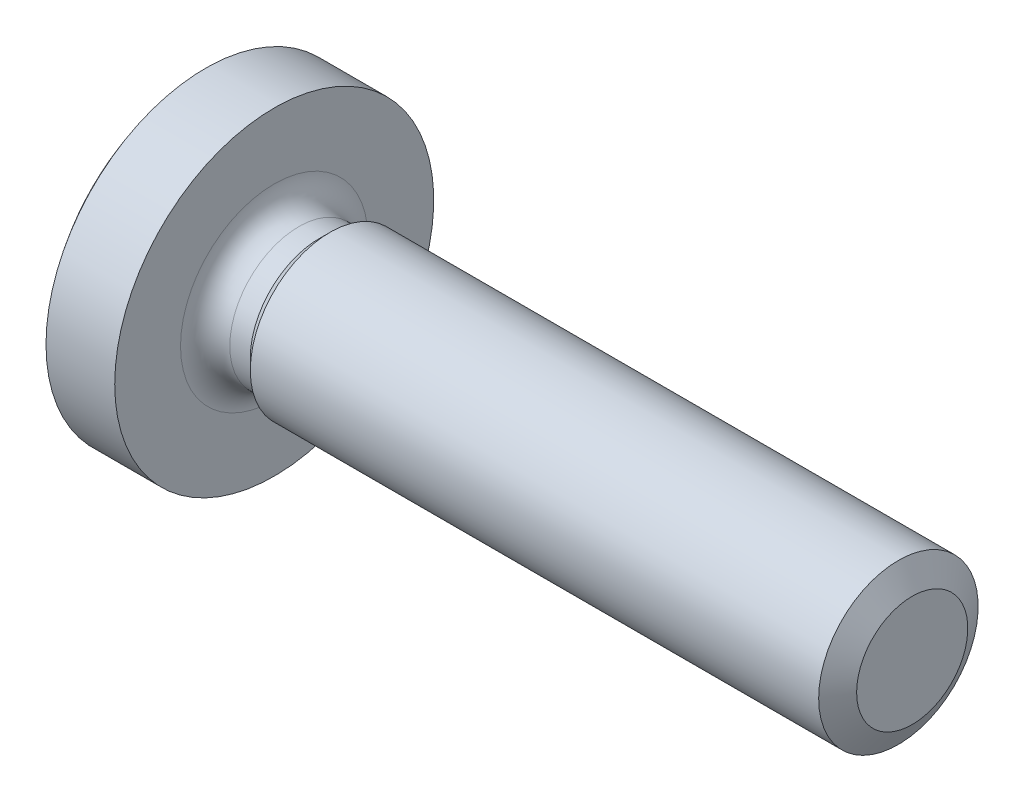
ISO-10303-21;
HEADER;
FILE_DESCRIPTION(('STEP AP214'),'2;1');
FILE_NAME('part.step','',(''),(''),'','','');
FILE_SCHEMA(('AUTOMOTIVE_DESIGN { 1 0 10303 214 1 1 1 1 }'));
ENDSEC;
DATA;
#1=APPLICATION_CONTEXT('core data for automotive mechanical design processes');
#2=APPLICATION_PROTOCOL_DEFINITION('international standard','automotive_design',2000,#1);
#3=PRODUCT_CONTEXT('',#1,'mechanical');
#4=PRODUCT('Part','Part','',(#3));
#5=PRODUCT_RELATED_PRODUCT_CATEGORY('part','',(#4));
#6=PRODUCT_DEFINITION_FORMATION('','',#4);
#7=PRODUCT_DEFINITION_CONTEXT('part definition',#1,'design');
#8=PRODUCT_DEFINITION('design','',#6,#7);
#9=PRODUCT_DEFINITION_SHAPE('','',#8);
#10=(LENGTH_UNIT() NAMED_UNIT(*) SI_UNIT(.MILLI.,.METRE.));
#11=(NAMED_UNIT(*) PLANE_ANGLE_UNIT() SI_UNIT($,.RADIAN.));
#12=(NAMED_UNIT(*) SI_UNIT($,.STERADIAN.) SOLID_ANGLE_UNIT());
#13=UNCERTAINTY_MEASURE_WITH_UNIT(LENGTH_MEASURE(1.E-05),#10,'distance_accuracy_value','');
#14=(GEOMETRIC_REPRESENTATION_CONTEXT(3) GLOBAL_UNCERTAINTY_ASSIGNED_CONTEXT((#13)) GLOBAL_UNIT_ASSIGNED_CONTEXT((#10,
#11,#12)) REPRESENTATION_CONTEXT('',''));
#15=CARTESIAN_POINT('',(0.,0.,0.));
#16=DIRECTION('',(0.,0.,1.));
#17=DIRECTION('',(1.,0.,0.));
#18=AXIS2_PLACEMENT_3D('',#15,#16,#17);
#19=CARTESIAN_POINT('',(2.4,0.,0.));
#20=DIRECTION('',(0.144306893071729,0.,-0.989532981063282));
#21=DIRECTION('',(-0.989532981063282,0.,-0.144306893071729));
#22=AXIS2_PLACEMENT_3D('',#19,#20,#21);
#23=PLANE('',#22);
#24=DIRECTION('',(-0.732931208059297,-0.671853607387689,-0.106885801175314));
#25=VECTOR('',#24,1.);
#26=CARTESIAN_POINT('',(2.4,0.,0.));
#27=LINE('',#26,#25);
#28=CARTESIAN_POINT('',(2.4,0.,0.));
#29=VERTEX_POINT('',#28);
#30=CARTESIAN_POINT('',(0.299339193338267,-1.92560573943992,-0.30634636763817));
#31=VERTEX_POINT('',#30);
#32=EDGE_CURVE('E167',#29,#31,#27,.T.);
#33=ORIENTED_EDGE('',*,*,#32,.F.);
#34=DIRECTION('',(-0.979387903800927,-0.142827402637635,-0.142827402637635));
#35=VECTOR('',#34,1.);
#36=CARTESIAN_POINT('',(2.4,0.,0.));
#37=LINE('',#36,#35);
#38=CARTESIAN_POINT('',(0.0185820115886168,-0.347290123309992,-0.347290123309993));
#39=VERTEX_POINT('',#38);
#40=EDGE_CURVE('E128',#29,#39,#37,.T.);
#41=ORIENTED_EDGE('',*,*,#40,.T.);
#42=CARTESIAN_POINT('',(6.41461963450914,0.,0.585465363365916));
#43=DIRECTION('',(0.144306893071729,0.,-0.989532981063282));
#44=DIRECTION('',(-0.989532981063282,0.,-0.144306893071729));
#45=AXIS2_PLACEMENT_3D('',#42,#43,#44);
#46=CIRCLE('',#45,6.47301633718682);
#47=EDGE_CURVE('E141',#31,#39,#46,.T.);
#48=ORIENTED_EDGE('',*,*,#47,.F.);
#49=EDGE_LOOP('',(#33,#41,#48));
#50=FACE_BOUND('',#49,.T.);
#51=ADVANCED_FACE('F48',(#50),#23,.F.);
#52=CARTESIAN_POINT('',(2.4,0.,0.));
#53=DIRECTION('',(0.144306893071729,0.,0.989532981063282));
#54=DIRECTION('',(0.989532981063282,0.,-0.144306893071729));
#55=AXIS2_PLACEMENT_3D('',#52,#53,#54);
#56=PLANE('',#55);
#57=CARTESIAN_POINT('',(6.41461963450914,0.,-0.585465363365916));
#58=DIRECTION('',(0.144306893071729,0.,0.989532981063282));
#59=DIRECTION('',(0.989532981063282,0.,-0.144306893071729));
#60=AXIS2_PLACEMENT_3D('',#57,#58,#59);
#61=CIRCLE('',#60,6.47301633718682);
#62=CARTESIAN_POINT('',(0.0185820115886177,-0.347290123309995,0.347290123309993));
#63=VERTEX_POINT('',#62);
#64=CARTESIAN_POINT('',(0.299339193338266,-1.92560573943992,0.30634636763817));
#65=VERTEX_POINT('',#64);
#66=EDGE_CURVE('E71',#63,#65,#61,.T.);
#67=ORIENTED_EDGE('',*,*,#66,.F.);
#68=DIRECTION('',(0.979387903800927,0.142827402637636,-0.142827402637635));
#69=VECTOR('',#68,1.);
#70=CARTESIAN_POINT('',(2.4,0.,0.));
#71=LINE('',#70,#69);
#72=EDGE_CURVE('E13',#63,#29,#71,.T.);
#73=ORIENTED_EDGE('',*,*,#72,.T.);
#74=DIRECTION('',(-0.732931208059297,-0.671853607387689,0.106885801175314));
#75=VECTOR('',#74,1.);
#76=CARTESIAN_POINT('',(2.4,0.,0.));
#77=LINE('',#76,#75);
#78=EDGE_CURVE('E168',#29,#65,#77,.T.);
#79=ORIENTED_EDGE('',*,*,#78,.T.);
#80=EDGE_LOOP('',(#67,#73,#79));
#81=FACE_BOUND('',#80,.T.);
#82=ADVANCED_FACE('F183',(#81),#56,.F.);
#83=CARTESIAN_POINT('',(-1.33175770411172,0.,0.));
#84=DIRECTION('',(-1.,0.,0.));
#85=DIRECTION('',(0.,0.,1.));
#86=AXIS2_PLACEMENT_3D('',#83,#84,#85);
#87=CYLINDRICAL_SURFACE('',#86,2.);
#88=CARTESIAN_POINT('',(4.5,0.,0.));
#89=DIRECTION('',(-1.,0.,0.));
#90=DIRECTION('',(0.,0.,1.));
#91=AXIS2_PLACEMENT_3D('',#88,#89,#90);
#92=CIRCLE('',#91,2.);
#93=CARTESIAN_POINT('',(4.5,0.,2.));
#94=VERTEX_POINT('',#93);
#95=EDGE_CURVE('E204',#94,#94,#92,.T.);
#96=ORIENTED_EDGE('',*,*,#95,.F.);
#97=EDGE_LOOP('',(#96));
#98=FACE_BOUND('',#97,.T.);
#99=CARTESIAN_POINT('',(18.753791204021,0.,0.));
#100=DIRECTION('',(-1.,0.,0.));
#101=DIRECTION('',(0.,0.,1.));
#102=AXIS2_PLACEMENT_3D('',#99,#100,#101);
#103=CIRCLE('',#102,2.);
#104=CARTESIAN_POINT('',(18.753791204021,0.,2.));
#105=VERTEX_POINT('',#104);
#106=EDGE_CURVE('E201',#105,#105,#103,.T.);
#107=ORIENTED_EDGE('',*,*,#106,.T.);
#108=EDGE_LOOP('',(#107));
#109=FACE_BOUND('',#108,.T.);
#110=ADVANCED_FACE('F248',(#98,#109),#87,.T.);
#111=CARTESIAN_POINT('',(6.5,0.,0.));
#112=DIRECTION('',(-1.,0.,0.));
#113=DIRECTION('',(0.,1.,0.));
#114=AXIS2_PLACEMENT_3D('',#111,#112,#113);
#115=SPHERICAL_SURFACE('',#114,6.5);
#116=CARTESIAN_POINT('',(4.62792452830189,0.,-2.0422641509434));
#117=DIRECTION('',(0.675724628517346,0.,0.737154140200741));
#118=DIRECTION('',(0.737154140200741,0.,-0.675724628517346));
#119=AXIS2_PLACEMENT_3D('',#116,#117,#118);
#120=CIRCLE('',#119,5.88000770118864);
#121=CARTESIAN_POINT('',(0.299339193338266,0.306346367638162,1.92560573943992));
#122=VERTEX_POINT('',#121);
#123=CARTESIAN_POINT('',(0.299339193338267,-0.306346367638176,1.92560573943992));
#124=VERTEX_POINT('',#123);
#125=EDGE_CURVE('E134',#122,#124,#120,.T.);
#126=ORIENTED_EDGE('',*,*,#125,.T.);
#127=CARTESIAN_POINT('',(6.41461963450914,0.585465363365916,0.));
#128=DIRECTION('',(0.144306893071729,-0.989532981063282,0.));
#129=DIRECTION('',(0.989532981063282,0.144306893071729,0.));
#130=AXIS2_PLACEMENT_3D('',#127,#128,#129);
#131=CIRCLE('',#130,6.47301633718682);
#132=EDGE_CURVE('E150',#124,#63,#131,.T.);
#133=ORIENTED_EDGE('',*,*,#132,.T.);
#134=ORIENTED_EDGE('',*,*,#66,.T.);
#135=CARTESIAN_POINT('',(4.62792452830189,2.0422641509434,0.));
#136=DIRECTION('',(0.675724628517346,-0.737154140200741,0.));
#137=DIRECTION('',(0.737154140200741,0.675724628517346,0.));
#138=AXIS2_PLACEMENT_3D('',#135,#136,#137);
#139=CIRCLE('',#138,5.88000770118864);
#140=EDGE_CURVE('E180',#65,#31,#139,.T.);
#141=ORIENTED_EDGE('',*,*,#140,.T.);
#142=ORIENTED_EDGE('',*,*,#47,.T.);
#143=CARTESIAN_POINT('',(0.299339193338267,-0.306346367638163,-1.92560573943992));
#144=VERTEX_POINT('',#143);
#145=EDGE_CURVE('E130',#39,#144,#131,.T.);
#146=ORIENTED_EDGE('',*,*,#145,.T.);
#147=CARTESIAN_POINT('',(4.62792452830189,0.,2.0422641509434));
#148=DIRECTION('',(0.675724628517346,0.,-0.737154140200741));
#149=DIRECTION('',(-0.737154140200741,0.,-0.675724628517346));
#150=AXIS2_PLACEMENT_3D('',#147,#148,#149);
#151=CIRCLE('',#150,5.88000770118864);
#152=CARTESIAN_POINT('',(0.299339193338266,0.306346367638176,-1.92560573943992));
#153=VERTEX_POINT('',#152);
#154=EDGE_CURVE('E122',#144,#153,#151,.T.);
#155=ORIENTED_EDGE('',*,*,#154,.T.);
#156=CARTESIAN_POINT('',(6.41461963450914,-0.585465363365916,0.));
#157=DIRECTION('',(0.144306893071729,0.989532981063282,0.));
#158=DIRECTION('',(-0.989532981063282,0.144306893071729,0.));
#159=AXIS2_PLACEMENT_3D('',#156,#157,#158);
#160=CIRCLE('',#159,6.47301633718682);
#161=CARTESIAN_POINT('',(0.0185820115886177,0.347290123309994,-0.347290123309993));
#162=VERTEX_POINT('',#161);
#163=EDGE_CURVE('E113',#153,#162,#160,.T.);
#164=ORIENTED_EDGE('',*,*,#163,.T.);
#165=CARTESIAN_POINT('',(0.299339193338267,1.92560573943992,-0.30634636763817));
#166=VERTEX_POINT('',#165);
#167=EDGE_CURVE('E158',#162,#166,#46,.T.);
#168=ORIENTED_EDGE('',*,*,#167,.T.);
#169=CARTESIAN_POINT('',(4.62792452830189,-2.0422641509434,0.));
#170=DIRECTION('',(0.675724628517346,0.737154140200741,0.));
#171=DIRECTION('',(-0.737154140200741,0.675724628517346,0.));
#172=AXIS2_PLACEMENT_3D('',#169,#170,#171);
#173=CIRCLE('',#172,5.88000770118864);
#174=CARTESIAN_POINT('',(0.299339193338266,1.92560573943992,0.306346367638169));
#175=VERTEX_POINT('',#174);
#176=EDGE_CURVE('E171',#166,#175,#173,.T.);
#177=ORIENTED_EDGE('',*,*,#176,.T.);
#178=CARTESIAN_POINT('',(0.0185820115886168,0.347290123309992,0.347290123309993));
#179=VERTEX_POINT('',#178);
#180=EDGE_CURVE('E163',#175,#179,#61,.T.);
#181=ORIENTED_EDGE('',*,*,#180,.T.);
#182=EDGE_CURVE('E63',#179,#122,#160,.T.);
#183=ORIENTED_EDGE('',*,*,#182,.T.);
#184=EDGE_LOOP('',(#126,#133,#134,#141,#142,#146,#155,#164,#168,#177,#181,#183));
#185=FACE_BOUND('',#184,.T.);
#186=CARTESIAN_POINT('',(1.3765246170202,0.,0.));
#187=DIRECTION('',(-1.,0.,0.));
#188=DIRECTION('',(0.,0.,1.));
#189=AXIS2_PLACEMENT_3D('',#186,#187,#188);
#190=CIRCLE('',#189,4.);
#191=CARTESIAN_POINT('',(1.3765246170202,0.,4.));
#192=VERTEX_POINT('',#191);
#193=EDGE_CURVE('E184',#192,#192,#190,.T.);
#194=ORIENTED_EDGE('',*,*,#193,.T.);
#195=EDGE_LOOP('',(#194));
#196=FACE_BOUND('',#195,.T.);
#197=ADVANCED_FACE('F50',(#185,#196),#115,.T.);
#198=CARTESIAN_POINT('',(-1.33175770411172,0.,0.));
#199=DIRECTION('',(-1.,0.,0.));
#200=DIRECTION('',(0.,0.,1.));
#201=AXIS2_PLACEMENT_3D('',#198,#199,#200);
#202=CYLINDRICAL_SURFACE('',#201,4.);
#203=ORIENTED_EDGE('',*,*,#193,.F.);
#204=EDGE_LOOP('',(#203));
#205=FACE_BOUND('',#204,.T.);
#206=CARTESIAN_POINT('',(3.1,0.,0.));
#207=DIRECTION('',(-1.,0.,0.));
#208=DIRECTION('',(0.,0.,1.));
#209=AXIS2_PLACEMENT_3D('',#206,#207,#208);
#210=CIRCLE('',#209,4.);
#211=CARTESIAN_POINT('',(3.1,0.,4.));
#212=VERTEX_POINT('',#211);
#213=EDGE_CURVE('E187',#212,#212,#210,.T.);
#214=ORIENTED_EDGE('',*,*,#213,.T.);
#215=EDGE_LOOP('',(#214));
#216=FACE_BOUND('',#215,.T.);
#217=ADVANCED_FACE('F221',(#205,#216),#202,.T.);
#218=CARTESIAN_POINT('',(3.1,2.35,0.));
#219=DIRECTION('',(-1.,0.,0.));
#220=DIRECTION('',(0.,0.,1.));
#221=AXIS2_PLACEMENT_3D('',#218,#219,#220);
#222=PLANE('',#221);
#223=ORIENTED_EDGE('',*,*,#213,.F.);
#224=EDGE_LOOP('',(#223));
#225=FACE_BOUND('',#224,.T.);
#226=CARTESIAN_POINT('',(3.1,0.,0.));
#227=DIRECTION('',(-1.,0.,0.));
#228=DIRECTION('',(0.,0.,1.));
#229=AXIS2_PLACEMENT_3D('',#226,#227,#228);
#230=CIRCLE('',#229,2.35);
#231=CARTESIAN_POINT('',(3.1,0.,2.35));
#232=VERTEX_POINT('',#231);
#233=EDGE_CURVE('E213',#232,#232,#230,.T.);
#234=ORIENTED_EDGE('',*,*,#233,.T.);
#235=EDGE_LOOP('',(#234));
#236=FACE_BOUND('',#235,.T.);
#237=ADVANCED_FACE('F223',(#225,#236),#222,.F.);
#238=CARTESIAN_POINT('',(3.718,0.,0.));
#239=DIRECTION('',(-1.,0.,0.));
#240=DIRECTION('',(0.,0.,1.));
#241=AXIS2_PLACEMENT_3D('',#238,#239,#240);
#242=TOROIDAL_SURFACE('',#241,2.35,0.618);
#243=ORIENTED_EDGE('',*,*,#233,.F.);
#244=EDGE_LOOP('',(#243));
#245=FACE_BOUND('',#244,.T.);
#246=CARTESIAN_POINT('',(3.718,0.,0.));
#247=DIRECTION('',(-1.,0.,0.));
#248=DIRECTION('',(0.,0.,1.));
#249=AXIS2_PLACEMENT_3D('',#246,#247,#248);
#250=CIRCLE('',#249,1.732);
#251=CARTESIAN_POINT('',(3.718,0.,1.732));
#252=VERTEX_POINT('',#251);
#253=EDGE_CURVE('E210',#252,#252,#250,.T.);
#254=ORIENTED_EDGE('',*,*,#253,.T.);
#255=EDGE_LOOP('',(#254));
#256=FACE_BOUND('',#255,.T.);
#257=ADVANCED_FACE('F226',(#245,#256),#242,.F.);
#258=CARTESIAN_POINT('',(-1.33175770411172,0.,0.));
#259=DIRECTION('',(-1.,0.,0.));
#260=DIRECTION('',(0.,0.,1.));
#261=AXIS2_PLACEMENT_3D('',#258,#259,#260);
#262=CYLINDRICAL_SURFACE('',#261,1.732);
#263=ORIENTED_EDGE('',*,*,#253,.F.);
#264=EDGE_LOOP('',(#263));
#265=FACE_BOUND('',#264,.T.);
#266=CARTESIAN_POINT('',(4.232,0.,0.));
#267=DIRECTION('',(-1.,0.,0.));
#268=DIRECTION('',(0.,0.,1.));
#269=AXIS2_PLACEMENT_3D('',#266,#267,#268);
#270=CIRCLE('',#269,1.732);
#271=CARTESIAN_POINT('',(4.232,0.,1.732));
#272=VERTEX_POINT('',#271);
#273=EDGE_CURVE('E207',#272,#272,#270,.T.);
#274=ORIENTED_EDGE('',*,*,#273,.T.);
#275=EDGE_LOOP('',(#274));
#276=FACE_BOUND('',#275,.T.);
#277=ADVANCED_FACE('F232',(#265,#276),#262,.T.);
#278=CARTESIAN_POINT('',(4.5,0.,0.));
#279=DIRECTION('',(1.,0.,0.));
#280=DIRECTION('',(0.,0.,-1.));
#281=AXIS2_PLACEMENT_3D('',#278,#279,#280);
#282=CONICAL_SURFACE('',#281,2.,0.785398163397443);
#283=ORIENTED_EDGE('',*,*,#273,.F.);
#284=EDGE_LOOP('',(#283));
#285=FACE_BOUND('',#284,.T.);
#286=ORIENTED_EDGE('',*,*,#95,.T.);
#287=EDGE_LOOP('',(#286));
#288=FACE_BOUND('',#287,.T.);
#289=ADVANCED_FACE('F238',(#285,#288),#282,.T.);
#290=CARTESIAN_POINT('',(18.753791204021,0.,0.));
#291=DIRECTION('',(-1.,0.,0.));
#292=DIRECTION('',(0.,0.,1.));
#293=AXIS2_PLACEMENT_3D('',#290,#291,#292);
#294=CONICAL_SURFACE('',#293,2.,1.05188801855298);
#295=CARTESIAN_POINT('',(19.1,0.,0.));
#296=DIRECTION('',(-1.,0.,0.));
#297=DIRECTION('',(0.,0.,1.));
#298=AXIS2_PLACEMENT_3D('',#295,#296,#297);
#299=CIRCLE('',#298,1.3938);
#300=CARTESIAN_POINT('',(19.1,0.,1.3938));
#301=VERTEX_POINT('',#300);
#302=EDGE_CURVE('E172',#301,#301,#299,.T.);
#303=ORIENTED_EDGE('',*,*,#302,.T.);
#304=EDGE_LOOP('',(#303));
#305=FACE_BOUND('',#304,.T.);
#306=ORIENTED_EDGE('',*,*,#106,.F.);
#307=EDGE_LOOP('',(#306));
#308=FACE_BOUND('',#307,.T.);
#309=ADVANCED_FACE('F244',(#305,#308),#294,.T.);
#310=CARTESIAN_POINT('',(19.1,0.,0.));
#311=DIRECTION('',(-1.,0.,0.));
#312=DIRECTION('',(0.,0.,1.));
#313=AXIS2_PLACEMENT_3D('',#310,#311,#312);
#314=PLANE('',#313);
#315=ORIENTED_EDGE('',*,*,#302,.F.);
#316=EDGE_LOOP('',(#315));
#317=FACE_BOUND('',#316,.T.);
#318=ADVANCED_FACE('F255',(#317),#314,.F.);
#319=ORIENTED_EDGE('',*,*,#167,.F.);
#320=DIRECTION('',(0.979387903800927,-0.142827402637636,0.142827402637635));
#321=VECTOR('',#320,1.);
#322=CARTESIAN_POINT('',(2.4,0.,0.));
#323=LINE('',#322,#321);
#324=EDGE_CURVE('E111',#162,#29,#323,.T.);
#325=ORIENTED_EDGE('',*,*,#324,.T.);
#326=DIRECTION('',(-0.732931208059297,0.671853607387689,-0.106885801175314));
#327=VECTOR('',#326,1.);
#328=CARTESIAN_POINT('',(2.4,0.,0.));
#329=LINE('',#328,#327);
#330=EDGE_CURVE('E157',#29,#166,#329,.T.);
#331=ORIENTED_EDGE('',*,*,#330,.T.);
#332=EDGE_LOOP('',(#319,#325,#331));
#333=FACE_BOUND('',#332,.T.);
#334=ADVANCED_FACE('F155',(#333),#23,.F.);
#335=CARTESIAN_POINT('',(0.,2.2,-0.35));
#336=DIRECTION('',(0.675724628517346,0.737154140200741,0.));
#337=DIRECTION('',(-0.737154140200741,0.675724628517346,0.));
#338=AXIS2_PLACEMENT_3D('',#335,#336,#337);
#339=PLANE('',#338);
#340=ORIENTED_EDGE('',*,*,#330,.F.);
#341=DIRECTION('',(-0.732931208059297,0.671853607387689,0.106885801175314));
#342=VECTOR('',#341,1.);
#343=CARTESIAN_POINT('',(2.4,0.,0.));
#344=LINE('',#343,#342);
#345=EDGE_CURVE('E161',#29,#175,#344,.T.);
#346=ORIENTED_EDGE('',*,*,#345,.T.);
#347=ORIENTED_EDGE('',*,*,#176,.F.);
#348=EDGE_LOOP('',(#340,#346,#347));
#349=FACE_BOUND('',#348,.T.);
#350=ADVANCED_FACE('F170',(#349),#339,.F.);
#351=CARTESIAN_POINT('',(0.,-2.2,0.35));
#352=DIRECTION('',(0.675724628517346,-0.737154140200741,0.));
#353=DIRECTION('',(0.737154140200741,0.675724628517346,0.));
#354=AXIS2_PLACEMENT_3D('',#351,#352,#353);
#355=PLANE('',#354);
#356=ORIENTED_EDGE('',*,*,#78,.F.);
#357=ORIENTED_EDGE('',*,*,#32,.T.);
#358=ORIENTED_EDGE('',*,*,#140,.F.);
#359=EDGE_LOOP('',(#356,#357,#358));
#360=FACE_BOUND('',#359,.T.);
#361=ADVANCED_FACE('F179',(#360),#355,.F.);
#362=ORIENTED_EDGE('',*,*,#345,.F.);
#363=DIRECTION('',(-0.979387903800927,0.142827402637635,0.142827402637635));
#364=VECTOR('',#363,1.);
#365=CARTESIAN_POINT('',(2.4,0.,0.));
#366=LINE('',#365,#364);
#367=EDGE_CURVE('E56',#29,#179,#366,.T.);
#368=ORIENTED_EDGE('',*,*,#367,.T.);
#369=ORIENTED_EDGE('',*,*,#180,.F.);
#370=EDGE_LOOP('',(#362,#368,#369));
#371=FACE_BOUND('',#370,.T.);
#372=ADVANCED_FACE('F162',(#371),#56,.F.);
#373=CARTESIAN_POINT('',(2.4,0.,0.));
#374=DIRECTION('',(0.144306893071729,-0.989532981063282,0.));
#375=DIRECTION('',(-0.989532981063282,-0.144306893071729,0.));
#376=AXIS2_PLACEMENT_3D('',#373,#374,#375);
#377=PLANE('',#376);
#378=DIRECTION('',(-0.732931208059297,-0.106885801175317,0.671853607387689));
#379=VECTOR('',#378,1.);
#380=CARTESIAN_POINT('',(2.4,0.,0.));
#381=LINE('',#380,#379);
#382=EDGE_CURVE('E125',#29,#124,#381,.T.);
#383=ORIENTED_EDGE('',*,*,#382,.F.);
#384=ORIENTED_EDGE('',*,*,#72,.F.);
#385=ORIENTED_EDGE('',*,*,#132,.F.);
#386=EDGE_LOOP('',(#383,#384,#385));
#387=FACE_BOUND('',#386,.T.);
#388=ADVANCED_FACE('F149',(#387),#377,.F.);
#389=CARTESIAN_POINT('',(2.4,0.,0.));
#390=DIRECTION('',(0.144306893071729,0.989532981063282,0.));
#391=DIRECTION('',(0.989532981063282,-0.144306893071729,0.));
#392=AXIS2_PLACEMENT_3D('',#389,#390,#391);
#393=PLANE('',#392);
#394=ORIENTED_EDGE('',*,*,#367,.F.);
#395=DIRECTION('',(-0.732931208059297,0.106885801175312,0.671853607387689));
#396=VECTOR('',#395,1.);
#397=CARTESIAN_POINT('',(2.4,0.,0.));
#398=LINE('',#397,#396);
#399=EDGE_CURVE('E116',#29,#122,#398,.T.);
#400=ORIENTED_EDGE('',*,*,#399,.T.);
#401=ORIENTED_EDGE('',*,*,#182,.F.);
#402=EDGE_LOOP('',(#394,#400,#401));
#403=FACE_BOUND('',#402,.T.);
#404=ADVANCED_FACE('F137',(#403),#393,.F.);
#405=CARTESIAN_POINT('',(0.,-0.350000000000008,2.2));
#406=DIRECTION('',(0.675724628517346,0.,0.737154140200741));
#407=DIRECTION('',(-0.737154140200741,0.,0.675724628517346));
#408=AXIS2_PLACEMENT_3D('',#405,#406,#407);
#409=PLANE('',#408);
#410=ORIENTED_EDGE('',*,*,#399,.F.);
#411=ORIENTED_EDGE('',*,*,#382,.T.);
#412=ORIENTED_EDGE('',*,*,#125,.F.);
#413=EDGE_LOOP('',(#410,#411,#412));
#414=FACE_BOUND('',#413,.T.);
#415=ADVANCED_FACE('F145',(#414),#409,.F.);
#416=ORIENTED_EDGE('',*,*,#40,.F.);
#417=DIRECTION('',(-0.732931208059297,-0.106885801175312,-0.671853607387689));
#418=VECTOR('',#417,1.);
#419=CARTESIAN_POINT('',(2.4,0.,0.));
#420=LINE('',#419,#418);
#421=EDGE_CURVE('E119',#29,#144,#420,.T.);
#422=ORIENTED_EDGE('',*,*,#421,.T.);
#423=ORIENTED_EDGE('',*,*,#145,.F.);
#424=EDGE_LOOP('',(#416,#422,#423));
#425=FACE_BOUND('',#424,.T.);
#426=ADVANCED_FACE('F129',(#425),#377,.F.);
#427=CARTESIAN_POINT('',(0.,0.350000000000008,-2.2));
#428=DIRECTION('',(0.675724628517346,0.,-0.737154140200741));
#429=DIRECTION('',(0.737154140200741,0.,0.675724628517346));
#430=AXIS2_PLACEMENT_3D('',#427,#428,#429);
#431=PLANE('',#430);
#432=ORIENTED_EDGE('',*,*,#421,.F.);
#433=DIRECTION('',(-0.732931208059297,0.106885801175317,-0.671853607387689));
#434=VECTOR('',#433,1.);
#435=CARTESIAN_POINT('',(2.4,0.,0.));
#436=LINE('',#435,#434);
#437=EDGE_CURVE('E107',#29,#153,#436,.T.);
#438=ORIENTED_EDGE('',*,*,#437,.T.);
#439=ORIENTED_EDGE('',*,*,#154,.F.);
#440=EDGE_LOOP('',(#432,#438,#439));
#441=FACE_BOUND('',#440,.T.);
#442=ADVANCED_FACE('F121',(#441),#431,.F.);
#443=ORIENTED_EDGE('',*,*,#437,.F.);
#444=ORIENTED_EDGE('',*,*,#324,.F.);
#445=ORIENTED_EDGE('',*,*,#163,.F.);
#446=EDGE_LOOP('',(#443,#444,#445));
#447=FACE_BOUND('',#446,.T.);
#448=ADVANCED_FACE('F109',(#447),#393,.F.);
#449=CLOSED_SHELL('',(#51,#82,#110,#197,#217,#237,#257,#277,#289,#309,#318,#334,#350,#361,#372,
#388,#404,#415,#426,#442,#448));
#450=MANIFOLD_SOLID_BREP('B2',#449);
#451=ADVANCED_BREP_SHAPE_REPRESENTATION('',(#18,#450),#14);
#452=SHAPE_DEFINITION_REPRESENTATION(#9,#451);
ENDSEC;
END-ISO-10303-21;
